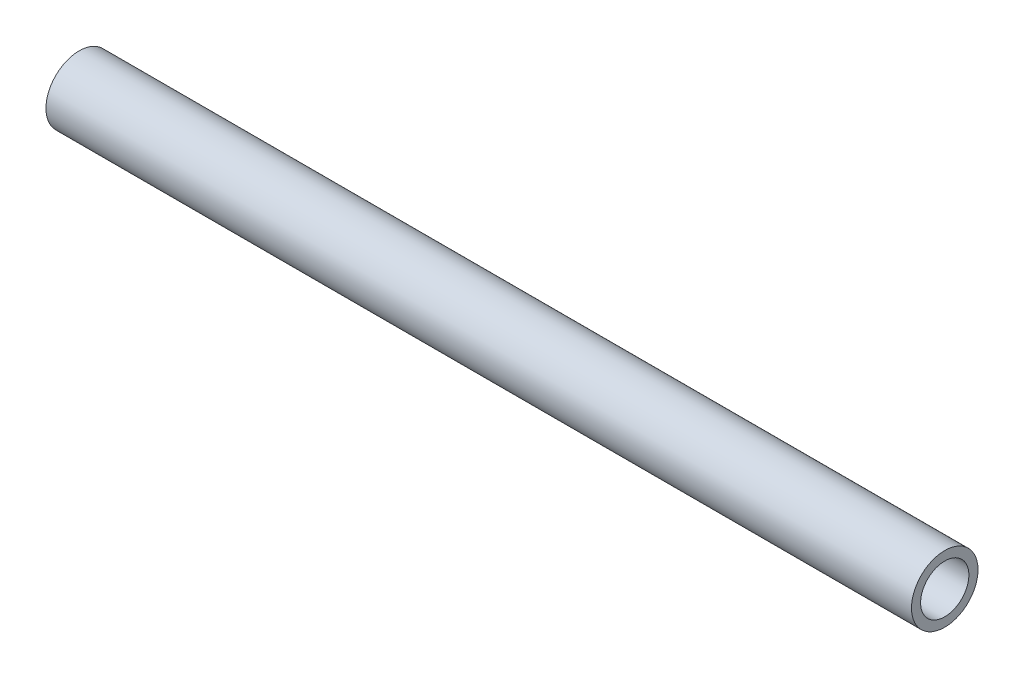
ISO-10303-21;
HEADER;
FILE_DESCRIPTION(('STEP AP214'),'2;1');
FILE_NAME('part.step','',(''),(''),'','','');
FILE_SCHEMA(('AUTOMOTIVE_DESIGN { 1 0 10303 214 1 1 1 1 }'));
ENDSEC;
DATA;
#1=APPLICATION_CONTEXT('core data for automotive mechanical design processes');
#2=APPLICATION_PROTOCOL_DEFINITION('international standard','automotive_design',2000,#1);
#3=PRODUCT_CONTEXT('',#1,'mechanical');
#4=PRODUCT('Part','Part','',(#3));
#5=PRODUCT_RELATED_PRODUCT_CATEGORY('part','',(#4));
#6=PRODUCT_DEFINITION_FORMATION('','',#4);
#7=PRODUCT_DEFINITION_CONTEXT('part definition',#1,'design');
#8=PRODUCT_DEFINITION('design','',#6,#7);
#9=PRODUCT_DEFINITION_SHAPE('','',#8);
#10=(LENGTH_UNIT() NAMED_UNIT(*) SI_UNIT(.MILLI.,.METRE.));
#11=(NAMED_UNIT(*) PLANE_ANGLE_UNIT() SI_UNIT($,.RADIAN.));
#12=(NAMED_UNIT(*) SI_UNIT($,.STERADIAN.) SOLID_ANGLE_UNIT());
#13=UNCERTAINTY_MEASURE_WITH_UNIT(LENGTH_MEASURE(1.E-05),#10,'distance_accuracy_value','');
#14=(GEOMETRIC_REPRESENTATION_CONTEXT(3) GLOBAL_UNCERTAINTY_ASSIGNED_CONTEXT((#13)) GLOBAL_UNIT_ASSIGNED_CONTEXT((#10,
#11,#12)) REPRESENTATION_CONTEXT('',''));
#15=CARTESIAN_POINT('',(0.,0.,0.));
#16=DIRECTION('',(0.,0.,1.));
#17=DIRECTION('',(1.,0.,0.));
#18=AXIS2_PLACEMENT_3D('',#15,#16,#17);
#19=CARTESIAN_POINT('',(342.2,0.,0.));
#20=DIRECTION('',(1.,0.,0.));
#21=DIRECTION('',(0.,0.,-1.));
#22=AXIS2_PLACEMENT_3D('',#19,#20,#21);
#23=PLANE('',#22);
#24=CARTESIAN_POINT('',(342.2,0.,0.));
#25=DIRECTION('',(1.,0.,0.));
#26=DIRECTION('',(0.,0.,-1.));
#27=AXIS2_PLACEMENT_3D('',#24,#25,#26);
#28=CIRCLE('',#27,13.15);
#29=CARTESIAN_POINT('',(342.2,0.,-13.15));
#30=VERTEX_POINT('',#29);
#31=EDGE_CURVE('E10',#30,#30,#28,.T.);
#32=ORIENTED_EDGE('',*,*,#31,.T.);
#33=EDGE_LOOP('',(#32));
#34=FACE_BOUND('',#33,.T.);
#35=CARTESIAN_POINT('',(342.2,0.,0.));
#36=DIRECTION('',(1.,0.,0.));
#37=DIRECTION('',(0.,0.,-1.));
#38=AXIS2_PLACEMENT_3D('',#35,#36,#37);
#39=CIRCLE('',#38,9.55);
#40=CARTESIAN_POINT('',(342.2,0.,-9.55));
#41=VERTEX_POINT('',#40);
#42=EDGE_CURVE('E43',#41,#41,#39,.T.);
#43=ORIENTED_EDGE('',*,*,#42,.F.);
#44=EDGE_LOOP('',(#43));
#45=FACE_BOUND('',#44,.T.);
#46=ADVANCED_FACE('F32',(#34,#45),#23,.T.);
#47=CARTESIAN_POINT('',(0.,0.,0.));
#48=DIRECTION('',(1.,0.,0.));
#49=DIRECTION('',(0.,0.,-1.));
#50=AXIS2_PLACEMENT_3D('',#47,#48,#49);
#51=PLANE('',#50);
#52=CARTESIAN_POINT('',(0.,0.,0.));
#53=DIRECTION('',(1.,0.,0.));
#54=DIRECTION('',(0.,0.,-1.));
#55=AXIS2_PLACEMENT_3D('',#52,#53,#54);
#56=CIRCLE('',#55,13.15);
#57=CARTESIAN_POINT('',(0.,0.,-13.15));
#58=VERTEX_POINT('',#57);
#59=EDGE_CURVE('E36',#58,#58,#56,.T.);
#60=ORIENTED_EDGE('',*,*,#59,.F.);
#61=EDGE_LOOP('',(#60));
#62=FACE_BOUND('',#61,.T.);
#63=CARTESIAN_POINT('',(0.,0.,0.));
#64=DIRECTION('',(1.,0.,0.));
#65=DIRECTION('',(0.,0.,-1.));
#66=AXIS2_PLACEMENT_3D('',#63,#64,#65);
#67=CIRCLE('',#66,9.55);
#68=CARTESIAN_POINT('',(0.,0.,-9.55));
#69=VERTEX_POINT('',#68);
#70=EDGE_CURVE('E45',#69,#69,#67,.T.);
#71=ORIENTED_EDGE('',*,*,#70,.T.);
#72=EDGE_LOOP('',(#71));
#73=FACE_BOUND('',#72,.T.);
#74=ADVANCED_FACE('F55',(#62,#73),#51,.F.);
#75=CARTESIAN_POINT('',(342.2,0.,0.));
#76=DIRECTION('',(-1.,0.,0.));
#77=DIRECTION('',(0.,0.,1.));
#78=AXIS2_PLACEMENT_3D('',#75,#76,#77);
#79=CYLINDRICAL_SURFACE('',#78,13.15);
#80=ORIENTED_EDGE('',*,*,#31,.F.);
#81=EDGE_LOOP('',(#80));
#82=FACE_BOUND('',#81,.T.);
#83=ORIENTED_EDGE('',*,*,#59,.T.);
#84=EDGE_LOOP('',(#83));
#85=FACE_BOUND('',#84,.T.);
#86=ADVANCED_FACE('F34',(#82,#85),#79,.T.);
#87=CARTESIAN_POINT('',(342.2,0.,0.));
#88=DIRECTION('',(-1.,0.,0.));
#89=DIRECTION('',(0.,0.,1.));
#90=AXIS2_PLACEMENT_3D('',#87,#88,#89);
#91=CYLINDRICAL_SURFACE('',#90,9.55);
#92=ORIENTED_EDGE('',*,*,#42,.T.);
#93=EDGE_LOOP('',(#92));
#94=FACE_BOUND('',#93,.T.);
#95=ORIENTED_EDGE('',*,*,#70,.F.);
#96=EDGE_LOOP('',(#95));
#97=FACE_BOUND('',#96,.T.);
#98=ADVANCED_FACE('F51',(#94,#97),#91,.F.);
#99=CLOSED_SHELL('',(#46,#74,#86,#98));
#100=MANIFOLD_SOLID_BREP('B2',#99);
#101=ADVANCED_BREP_SHAPE_REPRESENTATION('',(#18,#100),#14);
#102=SHAPE_DEFINITION_REPRESENTATION(#9,#101);
ENDSEC;
END-ISO-10303-21;
